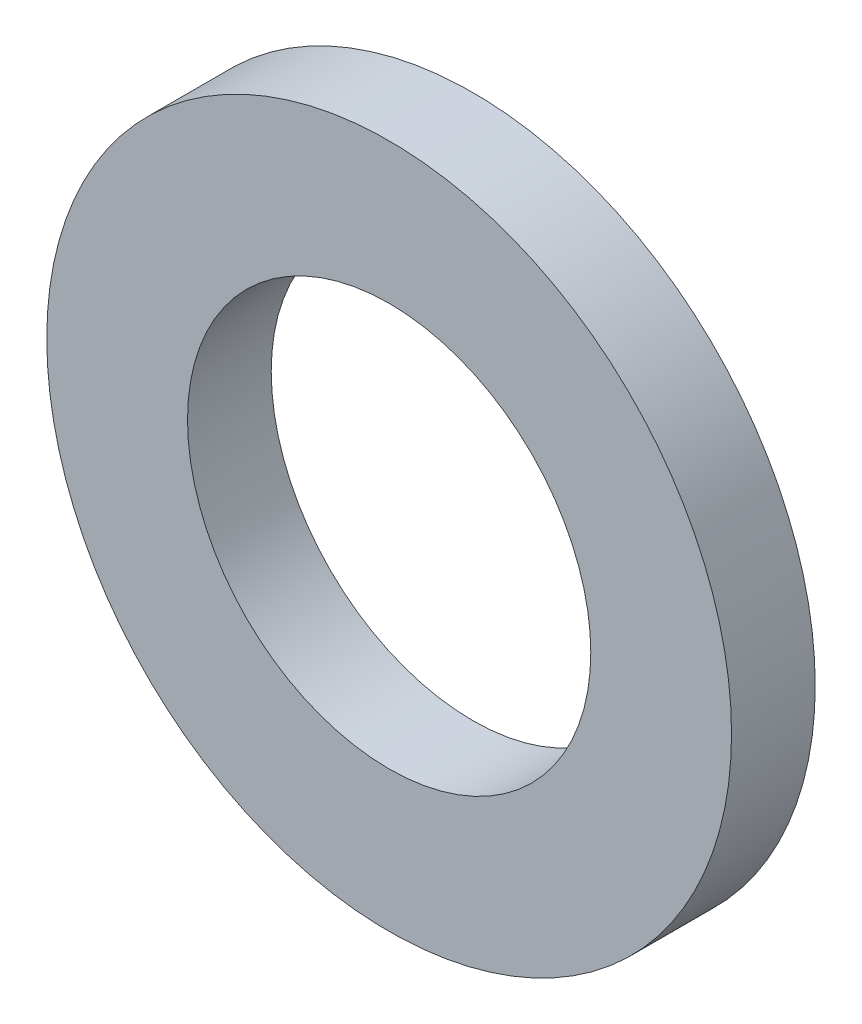
ISO-10303-21;
HEADER;
FILE_DESCRIPTION(('STEP AP214'),'2;1');
FILE_NAME('part.step','',(''),(''),'','','');
FILE_SCHEMA(('AUTOMOTIVE_DESIGN { 1 0 10303 214 1 1 1 1 }'));
ENDSEC;
DATA;
#1=APPLICATION_CONTEXT('core data for automotive mechanical design processes');
#2=APPLICATION_PROTOCOL_DEFINITION('international standard','automotive_design',2000,#1);
#3=PRODUCT_CONTEXT('',#1,'mechanical');
#4=PRODUCT('Part','Part','',(#3));
#5=PRODUCT_RELATED_PRODUCT_CATEGORY('part','',(#4));
#6=PRODUCT_DEFINITION_FORMATION('','',#4);
#7=PRODUCT_DEFINITION_CONTEXT('part definition',#1,'design');
#8=PRODUCT_DEFINITION('design','',#6,#7);
#9=PRODUCT_DEFINITION_SHAPE('','',#8);
#10=(LENGTH_UNIT() NAMED_UNIT(*) SI_UNIT(.MILLI.,.METRE.));
#11=(NAMED_UNIT(*) PLANE_ANGLE_UNIT() SI_UNIT($,.RADIAN.));
#12=(NAMED_UNIT(*) SI_UNIT($,.STERADIAN.) SOLID_ANGLE_UNIT());
#13=UNCERTAINTY_MEASURE_WITH_UNIT(LENGTH_MEASURE(1.E-05),#10,'distance_accuracy_value','');
#14=(GEOMETRIC_REPRESENTATION_CONTEXT(3) GLOBAL_UNCERTAINTY_ASSIGNED_CONTEXT((#13)) GLOBAL_UNIT_ASSIGNED_CONTEXT((#10,
#11,#12)) REPRESENTATION_CONTEXT('',''));
#15=CARTESIAN_POINT('',(0.,0.,0.));
#16=DIRECTION('',(0.,0.,1.));
#17=DIRECTION('',(1.,0.,0.));
#18=AXIS2_PLACEMENT_3D('',#15,#16,#17);
#19=CARTESIAN_POINT('',(3.88578058618805E-13,-5.55111512312578E-13,1.1000000000011));
#20=DIRECTION('',(0.,-1.2159717677207E-13,0.999999999999764));
#21=DIRECTION('',(1.00000000000037,0.,0.));
#22=AXIS2_PLACEMENT_3D('',#19,#20,#21);
#23=PLANE('',#22);
#24=CARTESIAN_POINT('',(3.88578058618805E-13,-5.55111512312578E-13,1.1000000000011));
#25=DIRECTION('',(0.,-1.2159717677207E-13,0.999999999999764));
#26=DIRECTION('',(1.00000000000037,0.,0.));
#27=AXIS2_PLACEMENT_3D('',#24,#25,#26);
#28=CIRCLE('',#27,4.5);
#29=CARTESIAN_POINT('',(-4.50000000000128,-9.85017623023083E-13,1.10000000000122));
#30=VERTEX_POINT('',#29);
#31=EDGE_CURVE('E12',#30,#30,#28,.T.);
#32=ORIENTED_EDGE('',*,*,#31,.T.);
#33=EDGE_LOOP('',(#32));
#34=FACE_BOUND('',#33,.T.);
#35=CARTESIAN_POINT('',(3.88578058618805E-13,-5.55111512312578E-13,1.1000000000011));
#36=DIRECTION('',(0.,-1.2159717677207E-13,0.999999999999764));
#37=DIRECTION('',(1.00000000000037,0.,0.));
#38=AXIS2_PLACEMENT_3D('',#35,#36,#37);
#39=CIRCLE('',#38,2.65);
#40=CARTESIAN_POINT('',(-2.6500000000006,-8.08278444175431E-13,1.10000000000117));
#41=VERTEX_POINT('',#40);
#42=EDGE_CURVE('E49',#41,#41,#39,.T.);
#43=ORIENTED_EDGE('',*,*,#42,.F.);
#44=EDGE_LOOP('',(#43));
#45=FACE_BOUND('',#44,.T.);
#46=ADVANCED_FACE('F38',(#34,#45),#23,.T.);
#47=CARTESIAN_POINT('',(0.,0.,0.));
#48=DIRECTION('',(0.,-1.2159717677207E-13,0.999999999999764));
#49=DIRECTION('',(1.00000000000037,0.,0.));
#50=AXIS2_PLACEMENT_3D('',#47,#48,#49);
#51=PLANE('',#50);
#52=CARTESIAN_POINT('',(0.,0.,0.));
#53=DIRECTION('',(0.,-1.2159717677207E-13,0.999999999999764));
#54=DIRECTION('',(1.00000000000037,0.,0.));
#55=AXIS2_PLACEMENT_3D('',#52,#53,#54);
#56=CIRCLE('',#55,4.5);
#57=CARTESIAN_POINT('',(-4.50000000000131,-8.51260728573641E-13,1.24466409401336E-13));
#58=VERTEX_POINT('',#57);
#59=EDGE_CURVE('E42',#58,#58,#56,.T.);
#60=ORIENTED_EDGE('',*,*,#59,.F.);
#61=EDGE_LOOP('',(#60));
#62=FACE_BOUND('',#61,.T.);
#63=CARTESIAN_POINT('',(0.,0.,0.));
#64=DIRECTION('',(0.,-1.2159717677207E-13,0.999999999999764));
#65=DIRECTION('',(1.00000000000037,0.,0.));
#66=AXIS2_PLACEMENT_3D('',#63,#64,#65);
#67=CIRCLE('',#66,2.65);
#68=CARTESIAN_POINT('',(-2.65000000000063,-6.74521549725989E-13,0.));
#69=VERTEX_POINT('',#68);
#70=EDGE_CURVE('E51',#69,#69,#67,.T.);
#71=ORIENTED_EDGE('',*,*,#70,.T.);
#72=EDGE_LOOP('',(#71));
#73=FACE_BOUND('',#72,.T.);
#74=ADVANCED_FACE('F61',(#62,#73),#51,.F.);
#75=CARTESIAN_POINT('',(3.88578058618805E-13,-5.55111512312578E-13,1.1000000000011));
#76=DIRECTION('',(0.,1.2159717677207E-13,-0.999999999999764));
#77=DIRECTION('',(-1.00000000000037,0.,0.));
#78=AXIS2_PLACEMENT_3D('',#75,#76,#77);
#79=CYLINDRICAL_SURFACE('',#78,4.5);
#80=CARTESIAN_POINT('',(-4.50000000000128,-9.85017623023083E-13,1.10000000000122));
#81=CARTESIAN_POINT('',(-4.50000000000128,-9.83624322039235E-13,1.08854166666788));
#82=CARTESIAN_POINT('',(-4.50000000000128,-9.82231021055387E-13,1.07708333333454));
#83=CARTESIAN_POINT('',(-4.50000000000128,-9.7944441908769E-13,1.05416666666785));
#84=CARTESIAN_POINT('',(-4.50000000000128,-9.78051118103842E-13,1.0427083333345));
#85=CARTESIAN_POINT('',(-4.50000000000128,-9.75264516136145E-13,1.01979166666781));
#86=CARTESIAN_POINT('',(-4.50000000000129,-9.73871215152297E-13,1.00833333333447));
#87=CARTESIAN_POINT('',(-4.50000000000129,-9.710846131846E-13,0.985416666667777));
#88=CARTESIAN_POINT('',(-4.50000000000129,-9.69691312200751E-13,0.973958333334432));
#89=CARTESIAN_POINT('',(-4.50000000000129,-9.66904710233055E-13,0.951041666667742));
#90=CARTESIAN_POINT('',(-4.50000000000129,-9.65511409249206E-13,0.939583333334398));
#91=CARTESIAN_POINT('',(-4.50000000000129,-9.6272480728151E-13,0.916666666667708));
#92=CARTESIAN_POINT('',(-4.50000000000129,-9.61331506297661E-13,0.905208333334363));
#93=CARTESIAN_POINT('',(-4.50000000000129,-9.58544904329964E-13,0.882291666667674));
#94=CARTESIAN_POINT('',(-4.50000000000129,-9.57151603346116E-13,0.870833333334329));
#95=CARTESIAN_POINT('',(-4.50000000000129,-9.5436500137842E-13,0.847916666667639));
#96=CARTESIAN_POINT('',(-4.50000000000129,-9.52971700394571E-13,0.836458333334294));
#97=CARTESIAN_POINT('',(-4.50000000000129,-9.50185098426875E-13,0.813541666667605));
#98=CARTESIAN_POINT('',(-4.50000000000129,-9.48791797443026E-13,0.80208333333426));
#99=CARTESIAN_POINT('',(-4.50000000000129,-9.46005195475329E-13,0.77916666666757));
#100=CARTESIAN_POINT('',(-4.50000000000129,-9.44611894491481E-13,0.767708333334226));
#101=CARTESIAN_POINT('',(-4.50000000000129,-9.41825292523784E-13,0.744791666667536));
#102=CARTESIAN_POINT('',(-4.50000000000129,-9.40431991539936E-13,0.733333333334191));
#103=CARTESIAN_POINT('',(-4.50000000000129,-9.37645389572239E-13,0.710416666667502));
#104=CARTESIAN_POINT('',(-4.50000000000129,-9.36252088588391E-13,0.698958333334157));
#105=CARTESIAN_POINT('',(-4.50000000000129,-9.33465486620694E-13,0.676041666667467));
#106=CARTESIAN_POINT('',(-4.50000000000129,-9.32072185636846E-13,0.664583333334122));
#107=CARTESIAN_POINT('',(-4.50000000000129,-9.29285583669149E-13,0.641666666667433));
#108=CARTESIAN_POINT('',(-4.5000000000013,-9.27892282685301E-13,0.630208333334088));
#109=CARTESIAN_POINT('',(-4.5000000000013,-9.25105680717604E-13,0.607291666667399));
#110=CARTESIAN_POINT('',(-4.5000000000013,-9.23712379733756E-13,0.595833333334054));
#111=CARTESIAN_POINT('',(-4.5000000000013,-9.20925777766059E-13,0.572916666667364));
#112=CARTESIAN_POINT('',(-4.5000000000013,-9.19532476782211E-13,0.561458333334019));
#113=CARTESIAN_POINT('',(-4.5000000000013,-9.16745874814514E-13,0.53854166666733));
#114=CARTESIAN_POINT('',(-4.5000000000013,-9.15352573830666E-13,0.527083333333985));
#115=CARTESIAN_POINT('',(-4.5000000000013,-9.12565971862969E-13,0.504166666667295));
#116=CARTESIAN_POINT('',(-4.5000000000013,-9.1117267087912E-13,0.492708333333951));
#117=CARTESIAN_POINT('',(-4.5000000000013,-9.08386068911424E-13,0.469791666667261));
#118=CARTESIAN_POINT('',(-4.5000000000013,-9.06992767927575E-13,0.458333333333916));
#119=CARTESIAN_POINT('',(-4.5000000000013,-9.04206165959879E-13,0.435416666667227));
#120=CARTESIAN_POINT('',(-4.5000000000013,-9.0281286497603E-13,0.423958333333882));
#121=CARTESIAN_POINT('',(-4.5000000000013,-9.00026263008334E-13,0.401041666667192));
#122=CARTESIAN_POINT('',(-4.5000000000013,-8.98632962024485E-13,0.389583333333847));
#123=CARTESIAN_POINT('',(-4.5000000000013,-8.95846360056788E-13,0.366666666667158));
#124=CARTESIAN_POINT('',(-4.5000000000013,-8.9445305907294E-13,0.355208333333813));
#125=CARTESIAN_POINT('',(-4.5000000000013,-8.91666457105243E-13,0.332291666667123));
#126=CARTESIAN_POINT('',(-4.5000000000013,-8.90273156121395E-13,0.320833333333779));
#127=CARTESIAN_POINT('',(-4.5000000000013,-8.87486554153698E-13,0.297916666667089));
#128=CARTESIAN_POINT('',(-4.5000000000013,-8.8609325316985E-13,0.286458333333744));
#129=CARTESIAN_POINT('',(-4.5000000000013,-8.83306651202153E-13,0.263541666667055));
#130=CARTESIAN_POINT('',(-4.5000000000013,-8.81913350218305E-13,0.25208333333371));
#131=CARTESIAN_POINT('',(-4.50000000000131,-8.79126748250608E-13,0.22916666666702));
#132=CARTESIAN_POINT('',(-4.50000000000131,-8.7773344726676E-13,0.217708333333676));
#133=CARTESIAN_POINT('',(-4.50000000000131,-8.74946845299063E-13,0.194791666666986));
#134=CARTESIAN_POINT('',(-4.50000000000131,-8.73553544315215E-13,0.183333333333641));
#135=CARTESIAN_POINT('',(-4.50000000000131,-8.70766942347518E-13,0.160416666666952));
#136=CARTESIAN_POINT('',(-4.50000000000131,-8.6937364136367E-13,0.148958333333607));
#137=CARTESIAN_POINT('',(-4.50000000000131,-8.66587039395973E-13,0.126041666666917));
#138=CARTESIAN_POINT('',(-4.50000000000131,-8.65193738412125E-13,0.114583333333572));
#139=CARTESIAN_POINT('',(-4.50000000000131,-8.62407136444428E-13,0.0916666666668828));
#140=CARTESIAN_POINT('',(-4.50000000000131,-8.61013835460579E-13,0.080208333333538));
#141=CARTESIAN_POINT('',(-4.50000000000131,-8.58227233492883E-13,0.0572916666668484));
#142=CARTESIAN_POINT('',(-4.50000000000131,-8.56833932509034E-13,0.0458333333335036));
#143=CARTESIAN_POINT('',(-4.50000000000131,-8.54047330541338E-13,0.0229166666668141));
#144=CARTESIAN_POINT('',(-4.50000000000131,-8.52654029557489E-13,0.0114583333334693));
#145=CARTESIAN_POINT('',(-4.50000000000131,-8.51260728573641E-13,1.24466409401336E-13));
#146=B_SPLINE_CURVE_WITH_KNOTS('',3,(#80,#81,#82,#83,#84,#85,#86,#87,#88,#89,#90,#91,#92,#93,
#94,#95,#96,#97,#98,#99,#100,#101,#102,#103,#104,#105,#106,#107,#108,#109,#110,#111,#112,#113,
#114,#115,#116,#117,#118,#119,#120,#121,#122,#123,#124,#125,#126,#127,#128,#129,#130,#131,#132,
#133,#134,#135,#136,#137,#138,#139,#140,#141,#142,#143,#144,#145),.UNSPECIFIED.,.F.,.F.,(4,2,2,
2,2,2,2,2,2,2,2,2,2,2,2,2,2,2,2,2,2,2,2,2,2,2,2,2,2,2,2,2,4),(0.,0.0343750000000346,
0.068750000000069,0.103125000000103,0.137500000000138,0.171875000000172,0.206250000000206,
0.240625000000241,0.275000000000275,0.30937500000031,0.343750000000344,0.378125000000378,
0.412500000000413,0.446875000000447,0.481250000000482,0.515625000000516,0.55000000000055,
0.584375000000585,0.618750000000619,0.653125000000653,0.687500000000688,0.721875000000722,
0.756250000000756,0.790625000000791,0.825000000000825,0.85937500000086,0.893750000000894,
0.928125000000928,0.962500000000963,0.996875000000997,1.03125000000103,1.06562500000107,
1.1000000000011),.UNSPECIFIED.);
#147=EDGE_CURVE('BSEAM40',#30,#58,#146,.T.);
#148=ORIENTED_EDGE('',*,*,#31,.F.);
#149=ORIENTED_EDGE('',*,*,#59,.T.);
#150=ORIENTED_EDGE('',*,*,#147,.T.);
#151=ORIENTED_EDGE('',*,*,#147,.F.);
#152=EDGE_LOOP('',(#148,#150,#149,#151));
#153=FACE_BOUND('',#152,.T.);
#154=ADVANCED_FACE('F40',(#153),#79,.T.);
#155=CARTESIAN_POINT('',(3.88578058618805E-13,-5.55111512312578E-13,1.1000000000011));
#156=DIRECTION('',(0.,1.2159717677207E-13,-0.999999999999764));
#157=DIRECTION('',(-1.00000000000037,0.,0.));
#158=AXIS2_PLACEMENT_3D('',#155,#156,#157);
#159=CYLINDRICAL_SURFACE('',#158,2.65);
#160=CARTESIAN_POINT('',(-2.6500000000006,-8.08278444175431E-13,1.10000000000117));
#161=CARTESIAN_POINT('',(-2.6500000000006,-8.06885143191583E-13,1.08854166666783));
#162=CARTESIAN_POINT('',(-2.6500000000006,-8.05491842207735E-13,1.07708333333448));
#163=CARTESIAN_POINT('',(-2.6500000000006,-8.02705240240038E-13,1.05416666666779));
#164=CARTESIAN_POINT('',(-2.6500000000006,-8.0131193925619E-13,1.04270833333445));
#165=CARTESIAN_POINT('',(-2.6500000000006,-7.98525337288493E-13,1.01979166666776));
#166=CARTESIAN_POINT('',(-2.6500000000006,-7.97132036304644E-13,1.00833333333442));
#167=CARTESIAN_POINT('',(-2.6500000000006,-7.94345434336948E-13,0.985416666667726));
#168=CARTESIAN_POINT('',(-2.6500000000006,-7.92952133353099E-13,0.973958333334381));
#169=CARTESIAN_POINT('',(-2.6500000000006,-7.90165531385403E-13,0.951041666667691));
#170=CARTESIAN_POINT('',(-2.6500000000006,-7.88772230401554E-13,0.939583333334346));
#171=CARTESIAN_POINT('',(-2.6500000000006,-7.85985628433858E-13,0.916666666667657));
#172=CARTESIAN_POINT('',(-2.6500000000006,-7.84592327450009E-13,0.905208333334312));
#173=CARTESIAN_POINT('',(-2.6500000000006,-7.81805725482312E-13,0.882291666667623));
#174=CARTESIAN_POINT('',(-2.6500000000006,-7.80412424498464E-13,0.870833333334278));
#175=CARTESIAN_POINT('',(-2.6500000000006,-7.77625822530767E-13,0.847916666667588));
#176=CARTESIAN_POINT('',(-2.6500000000006,-7.76232521546919E-13,0.836458333334243));
#177=CARTESIAN_POINT('',(-2.6500000000006,-7.73445919579222E-13,0.813541666667554));
#178=CARTESIAN_POINT('',(-2.6500000000006,-7.72052618595374E-13,0.802083333334209));
#179=CARTESIAN_POINT('',(-2.65000000000061,-7.69266016627677E-13,0.779166666667519));
#180=CARTESIAN_POINT('',(-2.65000000000061,-7.67872715643829E-13,0.767708333334175));
#181=CARTESIAN_POINT('',(-2.65000000000061,-7.65086113676132E-13,0.744791666667485));
#182=CARTESIAN_POINT('',(-2.65000000000061,-7.63692812692284E-13,0.73333333333414));
#183=CARTESIAN_POINT('',(-2.65000000000061,-7.60906210724587E-13,0.710416666667451));
#184=CARTESIAN_POINT('',(-2.65000000000061,-7.59512909740739E-13,0.698958333334106));
#185=CARTESIAN_POINT('',(-2.65000000000061,-7.56726307773042E-13,0.676041666667416));
#186=CARTESIAN_POINT('',(-2.65000000000061,-7.55333006789194E-13,0.664583333334071));
#187=CARTESIAN_POINT('',(-2.65000000000061,-7.52546404821497E-13,0.641666666667382));
#188=CARTESIAN_POINT('',(-2.65000000000061,-7.51153103837648E-13,0.630208333334037));
#189=CARTESIAN_POINT('',(-2.65000000000061,-7.48366501869952E-13,0.607291666667348));
#190=CARTESIAN_POINT('',(-2.65000000000061,-7.46973200886104E-13,0.595833333334003));
#191=CARTESIAN_POINT('',(-2.65000000000061,-7.44186598918407E-13,0.572916666667313));
#192=CARTESIAN_POINT('',(-2.65000000000061,-7.42793297934558E-13,0.561458333333968));
#193=CARTESIAN_POINT('',(-2.65000000000061,-7.40006695966862E-13,0.538541666667279));
#194=CARTESIAN_POINT('',(-2.65000000000061,-7.38613394983013E-13,0.527083333333934));
#195=CARTESIAN_POINT('',(-2.65000000000061,-7.35826793015317E-13,0.504166666667244));
#196=CARTESIAN_POINT('',(-2.65000000000061,-7.34433492031468E-13,0.4927083333339));
#197=CARTESIAN_POINT('',(-2.65000000000061,-7.31646890063772E-13,0.46979166666721));
#198=CARTESIAN_POINT('',(-2.65000000000061,-7.30253589079923E-13,0.458333333333865));
#199=CARTESIAN_POINT('',(-2.65000000000061,-7.27466987112226E-13,0.435416666667176));
#200=CARTESIAN_POINT('',(-2.65000000000061,-7.26073686128378E-13,0.423958333333831));
#201=CARTESIAN_POINT('',(-2.65000000000062,-7.23287084160681E-13,0.401041666667141));
#202=CARTESIAN_POINT('',(-2.65000000000062,-7.21893783176833E-13,0.389583333333797));
#203=CARTESIAN_POINT('',(-2.65000000000062,-7.19107181209136E-13,0.366666666667107));
#204=CARTESIAN_POINT('',(-2.65000000000062,-7.17713880225288E-13,0.355208333333762));
#205=CARTESIAN_POINT('',(-2.65000000000062,-7.14927278257591E-13,0.332291666667073));
#206=CARTESIAN_POINT('',(-2.65000000000062,-7.13533977273743E-13,0.320833333333728));
#207=CARTESIAN_POINT('',(-2.65000000000062,-7.10747375306046E-13,0.297916666667038));
#208=CARTESIAN_POINT('',(-2.65000000000062,-7.09354074322198E-13,0.286458333333693));
#209=CARTESIAN_POINT('',(-2.65000000000062,-7.06567472354501E-13,0.263541666667004));
#210=CARTESIAN_POINT('',(-2.65000000000062,-7.05174171370653E-13,0.252083333333659));
#211=CARTESIAN_POINT('',(-2.65000000000062,-7.02387569402956E-13,0.229166666666969));
#212=CARTESIAN_POINT('',(-2.65000000000062,-7.00994268419108E-13,0.217708333333625));
#213=CARTESIAN_POINT('',(-2.65000000000062,-6.98207666451411E-13,0.194791666666935));
#214=CARTESIAN_POINT('',(-2.65000000000062,-6.96814365467563E-13,0.18333333333359));
#215=CARTESIAN_POINT('',(-2.65000000000062,-6.94027763499866E-13,0.160416666666901));
#216=CARTESIAN_POINT('',(-2.65000000000062,-6.92634462516018E-13,0.148958333333556));
#217=CARTESIAN_POINT('',(-2.65000000000062,-6.89847860548321E-13,0.126041666666866));
#218=CARTESIAN_POINT('',(-2.65000000000062,-6.88454559564472E-13,0.114583333333521));
#219=CARTESIAN_POINT('',(-2.65000000000062,-6.85667957596776E-13,0.0916666666668318));
#220=CARTESIAN_POINT('',(-2.65000000000062,-6.84274656612927E-13,0.0802083333334871));
#221=CARTESIAN_POINT('',(-2.65000000000062,-6.8148805464523E-13,0.0572916666667975));
#222=CARTESIAN_POINT('',(-2.65000000000062,-6.80094753661382E-13,0.0458333333334527));
#223=CARTESIAN_POINT('',(-2.65000000000063,-6.77308151693685E-13,0.0229166666667631));
#224=CARTESIAN_POINT('',(-2.65000000000063,-6.75914850709837E-13,0.0114583333334183));
#225=CARTESIAN_POINT('',(-2.65000000000063,-6.74521549725989E-13,0.));
#226=B_SPLINE_CURVE_WITH_KNOTS('',3,(#160,#161,#162,#163,#164,#165,#166,#167,#168,#169,#170,
#171,#172,#173,#174,#175,#176,#177,#178,#179,#180,#181,#182,#183,#184,#185,#186,#187,#188,#189,
#190,#191,#192,#193,#194,#195,#196,#197,#198,#199,#200,#201,#202,#203,#204,#205,#206,#207,#208,
#209,#210,#211,#212,#213,#214,#215,#216,#217,#218,#219,#220,#221,#222,#223,#224,#225),
.UNSPECIFIED.,.F.,.F.,(4,2,2,2,2,2,2,2,2,2,2,2,2,2,2,2,2,2,2,2,2,2,2,2,2,2,2,2,2,2,2,2,4),(0.,
0.0343750000000342,0.0687500000000685,0.103125000000103,0.137500000000137,0.171875000000172,
0.206250000000206,0.24062500000024,0.275000000000275,0.309375000000309,0.343750000000344,
0.378125000000378,0.412500000000412,0.446875000000447,0.481250000000481,0.515625000000515,
0.55000000000055,0.584375000000584,0.618750000000619,0.653125000000653,0.687500000000687,
0.721875000000722,0.756250000000756,0.79062500000079,0.825000000000825,0.859375000000859,
0.893750000000894,0.928125000000928,0.962500000000962,0.996875000000997,1.03125000000103,
1.06562500000107,1.1000000000011),.UNSPECIFIED.);
#227=EDGE_CURVE('BSEAM57',#41,#69,#226,.T.);
#228=ORIENTED_EDGE('',*,*,#42,.T.);
#229=ORIENTED_EDGE('',*,*,#70,.F.);
#230=ORIENTED_EDGE('',*,*,#227,.T.);
#231=ORIENTED_EDGE('',*,*,#227,.F.);
#232=EDGE_LOOP('',(#228,#230,#229,#231));
#233=FACE_BOUND('',#232,.T.);
#234=ADVANCED_FACE('F57',(#233),#159,.F.);
#235=CLOSED_SHELL('',(#46,#74,#154,#234));
#236=MANIFOLD_SOLID_BREP('B2',#235);
#237=ADVANCED_BREP_SHAPE_REPRESENTATION('',(#18,#236),#14);
#238=SHAPE_DEFINITION_REPRESENTATION(#9,#237);
ENDSEC;
END-ISO-10303-21;
